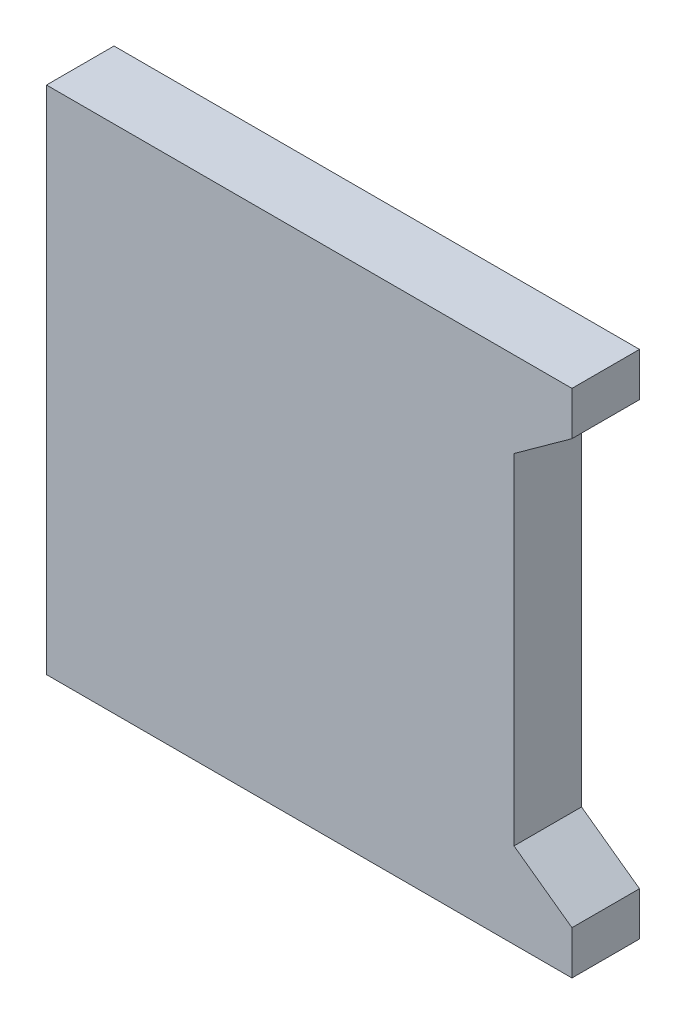
ISO-10303-21;
HEADER;
FILE_DESCRIPTION(('STEP AP214'),'2;1');
FILE_NAME('part.step','',(''),(''),'','','');
FILE_SCHEMA(('AUTOMOTIVE_DESIGN { 1 0 10303 214 1 1 1 1 }'));
ENDSEC;
DATA;
#1=APPLICATION_CONTEXT('core data for automotive mechanical design processes');
#2=APPLICATION_PROTOCOL_DEFINITION('international standard','automotive_design',2000,#1);
#3=PRODUCT_CONTEXT('',#1,'mechanical');
#4=PRODUCT('Part','Part','',(#3));
#5=PRODUCT_RELATED_PRODUCT_CATEGORY('part','',(#4));
#6=PRODUCT_DEFINITION_FORMATION('','',#4);
#7=PRODUCT_DEFINITION_CONTEXT('part definition',#1,'design');
#8=PRODUCT_DEFINITION('design','',#6,#7);
#9=PRODUCT_DEFINITION_SHAPE('','',#8);
#10=(LENGTH_UNIT() NAMED_UNIT(*) SI_UNIT(.MILLI.,.METRE.));
#11=(NAMED_UNIT(*) PLANE_ANGLE_UNIT() SI_UNIT($,.RADIAN.));
#12=(NAMED_UNIT(*) SI_UNIT($,.STERADIAN.) SOLID_ANGLE_UNIT());
#13=UNCERTAINTY_MEASURE_WITH_UNIT(LENGTH_MEASURE(1.E-05),#10,'distance_accuracy_value','');
#14=(GEOMETRIC_REPRESENTATION_CONTEXT(3) GLOBAL_UNCERTAINTY_ASSIGNED_CONTEXT((#13)) GLOBAL_UNIT_ASSIGNED_CONTEXT((#10,
#11,#12)) REPRESENTATION_CONTEXT('',''));
#15=CARTESIAN_POINT('',(0.,0.,0.));
#16=DIRECTION('',(0.,0.,1.));
#17=DIRECTION('',(1.,0.,0.));
#18=AXIS2_PLACEMENT_3D('',#15,#16,#17);
#19=CARTESIAN_POINT('',(0.,0.,1.55));
#20=DIRECTION('',(1.,0.,0.));
#21=DIRECTION('',(0.,0.,-1.));
#22=AXIS2_PLACEMENT_3D('',#19,#20,#21);
#23=PLANE('',#22);
#24=DIRECTION('',(0.,-1.,0.));
#25=VECTOR('',#24,1.);
#26=CARTESIAN_POINT('',(0.,0.,0.));
#27=LINE('',#26,#25);
#28=CARTESIAN_POINT('',(0.,11.72,0.));
#29=VERTEX_POINT('',#28);
#30=CARTESIAN_POINT('',(0.,0.,0.));
#31=VERTEX_POINT('',#30);
#32=EDGE_CURVE('E128',#29,#31,#27,.T.);
#33=ORIENTED_EDGE('',*,*,#32,.T.);
#34=DIRECTION('',(0.,0.,-1.));
#35=VECTOR('',#34,1.);
#36=CARTESIAN_POINT('',(0.,0.,1.55));
#37=LINE('',#36,#35);
#38=CARTESIAN_POINT('',(0.,0.,1.55));
#39=VERTEX_POINT('',#38);
#40=EDGE_CURVE('E11',#39,#31,#37,.T.);
#41=ORIENTED_EDGE('',*,*,#40,.F.);
#42=DIRECTION('',(0.,-1.,0.));
#43=VECTOR('',#42,1.);
#44=CARTESIAN_POINT('',(0.,0.,1.55));
#45=LINE('',#44,#43);
#46=CARTESIAN_POINT('',(0.,11.72,1.55));
#47=VERTEX_POINT('',#46);
#48=EDGE_CURVE('E142',#47,#39,#45,.T.);
#49=ORIENTED_EDGE('',*,*,#48,.F.);
#50=DIRECTION('',(0.,0.,-1.));
#51=VECTOR('',#50,1.);
#52=CARTESIAN_POINT('',(0.,11.72,1.55));
#53=LINE('',#52,#51);
#54=EDGE_CURVE('E124',#47,#29,#53,.T.);
#55=ORIENTED_EDGE('',*,*,#54,.T.);
#56=EDGE_LOOP('',(#33,#41,#49,#55));
#57=FACE_BOUND('',#56,.T.);
#58=ADVANCED_FACE('F32',(#57),#23,.F.);
#59=CARTESIAN_POINT('',(0.,0.,1.55));
#60=DIRECTION('',(0.,1.,0.));
#61=DIRECTION('',(0.,0.,1.));
#62=AXIS2_PLACEMENT_3D('',#59,#60,#61);
#63=PLANE('',#62);
#64=DIRECTION('',(1.,0.,0.));
#65=VECTOR('',#64,1.);
#66=CARTESIAN_POINT('',(0.,0.,0.));
#67=LINE('',#66,#65);
#68=CARTESIAN_POINT('',(12.06,0.,0.));
#69=VERTEX_POINT('',#68);
#70=EDGE_CURVE('E131',#31,#69,#67,.T.);
#71=ORIENTED_EDGE('',*,*,#70,.T.);
#72=DIRECTION('',(0.,0.,-1.));
#73=VECTOR('',#72,1.);
#74=CARTESIAN_POINT('',(12.06,0.,1.55));
#75=LINE('',#74,#73);
#76=CARTESIAN_POINT('',(12.06,0.,1.55));
#77=VERTEX_POINT('',#76);
#78=EDGE_CURVE('E40',#77,#69,#75,.T.);
#79=ORIENTED_EDGE('',*,*,#78,.F.);
#80=DIRECTION('',(1.,0.,0.));
#81=VECTOR('',#80,1.);
#82=CARTESIAN_POINT('',(0.,0.,1.55));
#83=LINE('',#82,#81);
#84=EDGE_CURVE('E91',#39,#77,#83,.T.);
#85=ORIENTED_EDGE('',*,*,#84,.F.);
#86=ORIENTED_EDGE('',*,*,#40,.T.);
#87=EDGE_LOOP('',(#71,#79,#85,#86));
#88=FACE_BOUND('',#87,.T.);
#89=ADVANCED_FACE('F177',(#88),#63,.F.);
#90=CARTESIAN_POINT('',(12.06,0.,1.55));
#91=DIRECTION('',(-1.,0.,0.));
#92=DIRECTION('',(0.,0.,1.));
#93=AXIS2_PLACEMENT_3D('',#90,#91,#92);
#94=PLANE('',#93);
#95=DIRECTION('',(0.,1.,0.));
#96=VECTOR('',#95,1.);
#97=CARTESIAN_POINT('',(12.06,0.,0.));
#98=LINE('',#97,#96);
#99=CARTESIAN_POINT('',(12.06,1.,0.));
#100=VERTEX_POINT('',#99);
#101=EDGE_CURVE('E133',#69,#100,#98,.T.);
#102=ORIENTED_EDGE('',*,*,#101,.T.);
#103=DIRECTION('',(0.,0.,-1.));
#104=VECTOR('',#103,1.);
#105=CARTESIAN_POINT('',(12.06,1.,1.55));
#106=LINE('',#105,#104);
#107=CARTESIAN_POINT('',(12.06,1.,1.55));
#108=VERTEX_POINT('',#107);
#109=EDGE_CURVE('E149',#108,#100,#106,.T.);
#110=ORIENTED_EDGE('',*,*,#109,.F.);
#111=DIRECTION('',(0.,1.,0.));
#112=VECTOR('',#111,1.);
#113=CARTESIAN_POINT('',(12.06,0.,1.55));
#114=LINE('',#113,#112);
#115=EDGE_CURVE('E157',#77,#108,#114,.T.);
#116=ORIENTED_EDGE('',*,*,#115,.F.);
#117=ORIENTED_EDGE('',*,*,#78,.T.);
#118=EDGE_LOOP('',(#102,#110,#116,#117));
#119=FACE_BOUND('',#118,.T.);
#120=ADVANCED_FACE('F155',(#119),#94,.F.);
#121=CARTESIAN_POINT('',(10.73,1.96,1.55));
#122=DIRECTION('',(-0.585267940011796,-0.810839958558006,0.));
#123=DIRECTION('',(0.810839958558006,-0.585267940011796,0.));
#124=AXIS2_PLACEMENT_3D('',#121,#122,#123);
#125=PLANE('',#124);
#126=DIRECTION('',(-0.810839958558006,0.585267940011796,0.));
#127=VECTOR('',#126,1.);
#128=CARTESIAN_POINT('',(10.73,1.96,0.));
#129=LINE('',#128,#127);
#130=CARTESIAN_POINT('',(10.73,1.96,0.));
#131=VERTEX_POINT('',#130);
#132=EDGE_CURVE('E135',#100,#131,#129,.T.);
#133=ORIENTED_EDGE('',*,*,#132,.T.);
#134=DIRECTION('',(0.,0.,-1.));
#135=VECTOR('',#134,1.);
#136=CARTESIAN_POINT('',(10.73,1.96,1.55));
#137=LINE('',#136,#135);
#138=CARTESIAN_POINT('',(10.73,1.96,1.55));
#139=VERTEX_POINT('',#138);
#140=EDGE_CURVE('E146',#139,#131,#137,.T.);
#141=ORIENTED_EDGE('',*,*,#140,.F.);
#142=DIRECTION('',(-0.810839958558006,0.585267940011796,0.));
#143=VECTOR('',#142,1.);
#144=CARTESIAN_POINT('',(10.73,1.96,1.55));
#145=LINE('',#144,#143);
#146=EDGE_CURVE('E169',#108,#139,#145,.T.);
#147=ORIENTED_EDGE('',*,*,#146,.F.);
#148=ORIENTED_EDGE('',*,*,#109,.T.);
#149=EDGE_LOOP('',(#133,#141,#147,#148));
#150=FACE_BOUND('',#149,.T.);
#151=ADVANCED_FACE('F165',(#150),#125,.F.);
#152=CARTESIAN_POINT('',(10.73,1.96,1.55));
#153=DIRECTION('',(-1.,0.,0.));
#154=DIRECTION('',(0.,-1.,0.));
#155=AXIS2_PLACEMENT_3D('',#152,#153,#154);
#156=PLANE('',#155);
#157=DIRECTION('',(0.,1.,0.));
#158=VECTOR('',#157,1.);
#159=CARTESIAN_POINT('',(10.73,1.96,0.));
#160=LINE('',#159,#158);
#161=CARTESIAN_POINT('',(10.73,9.76,0.));
#162=VERTEX_POINT('',#161);
#163=EDGE_CURVE('E137',#131,#162,#160,.T.);
#164=ORIENTED_EDGE('',*,*,#163,.T.);
#165=DIRECTION('',(0.,0.,-1.));
#166=VECTOR('',#165,1.);
#167=CARTESIAN_POINT('',(10.73,9.76,1.55));
#168=LINE('',#167,#166);
#169=CARTESIAN_POINT('',(10.73,9.76,1.55));
#170=VERTEX_POINT('',#169);
#171=EDGE_CURVE('E119',#170,#162,#168,.T.);
#172=ORIENTED_EDGE('',*,*,#171,.F.);
#173=DIRECTION('',(0.,1.,0.));
#174=VECTOR('',#173,1.);
#175=CARTESIAN_POINT('',(10.73,1.96,1.55));
#176=LINE('',#175,#174);
#177=EDGE_CURVE('E110',#139,#170,#176,.T.);
#178=ORIENTED_EDGE('',*,*,#177,.F.);
#179=ORIENTED_EDGE('',*,*,#140,.T.);
#180=EDGE_LOOP('',(#164,#172,#178,#179));
#181=FACE_BOUND('',#180,.T.);
#182=ADVANCED_FACE('F168',(#181),#156,.F.);
#183=CARTESIAN_POINT('',(10.73,9.76,1.55));
#184=DIRECTION('',(-0.585267940011796,0.810839958558006,0.));
#185=DIRECTION('',(-0.810839958558006,-0.585267940011796,0.));
#186=AXIS2_PLACEMENT_3D('',#183,#184,#185);
#187=PLANE('',#186);
#188=DIRECTION('',(0.810839958558006,0.585267940011796,0.));
#189=VECTOR('',#188,1.);
#190=CARTESIAN_POINT('',(10.73,9.76,0.));
#191=LINE('',#190,#189);
#192=CARTESIAN_POINT('',(12.06,10.72,0.));
#193=VERTEX_POINT('',#192);
#194=EDGE_CURVE('E118',#162,#193,#191,.T.);
#195=ORIENTED_EDGE('',*,*,#194,.T.);
#196=DIRECTION('',(0.,0.,-1.));
#197=VECTOR('',#196,1.);
#198=CARTESIAN_POINT('',(12.06,10.72,1.55));
#199=LINE('',#198,#197);
#200=CARTESIAN_POINT('',(12.06,10.72,1.55));
#201=VERTEX_POINT('',#200);
#202=EDGE_CURVE('E115',#201,#193,#199,.T.);
#203=ORIENTED_EDGE('',*,*,#202,.F.);
#204=DIRECTION('',(0.810839958558006,0.585267940011796,0.));
#205=VECTOR('',#204,1.);
#206=CARTESIAN_POINT('',(10.73,9.76,1.55));
#207=LINE('',#206,#205);
#208=EDGE_CURVE('E104',#170,#201,#207,.T.);
#209=ORIENTED_EDGE('',*,*,#208,.F.);
#210=ORIENTED_EDGE('',*,*,#171,.T.);
#211=EDGE_LOOP('',(#195,#203,#209,#210));
#212=FACE_BOUND('',#211,.T.);
#213=ADVANCED_FACE('F116',(#212),#187,.F.);
#214=CARTESIAN_POINT('',(12.06,10.72,1.55));
#215=DIRECTION('',(-1.,0.,0.));
#216=DIRECTION('',(0.,-1.,0.));
#217=AXIS2_PLACEMENT_3D('',#214,#215,#216);
#218=PLANE('',#217);
#219=DIRECTION('',(0.,1.,0.));
#220=VECTOR('',#219,1.);
#221=CARTESIAN_POINT('',(12.06,10.72,0.));
#222=LINE('',#221,#220);
#223=CARTESIAN_POINT('',(12.06,11.72,0.));
#224=VERTEX_POINT('',#223);
#225=EDGE_CURVE('E77',#193,#224,#222,.T.);
#226=ORIENTED_EDGE('',*,*,#225,.T.);
#227=DIRECTION('',(0.,0.,-1.));
#228=VECTOR('',#227,1.);
#229=CARTESIAN_POINT('',(12.06,11.72,1.55));
#230=LINE('',#229,#228);
#231=CARTESIAN_POINT('',(12.06,11.72,1.55));
#232=VERTEX_POINT('',#231);
#233=EDGE_CURVE('E120',#232,#224,#230,.T.);
#234=ORIENTED_EDGE('',*,*,#233,.F.);
#235=DIRECTION('',(0.,1.,0.));
#236=VECTOR('',#235,1.);
#237=CARTESIAN_POINT('',(12.06,10.72,1.55));
#238=LINE('',#237,#236);
#239=EDGE_CURVE('E108',#201,#232,#238,.T.);
#240=ORIENTED_EDGE('',*,*,#239,.F.);
#241=ORIENTED_EDGE('',*,*,#202,.T.);
#242=EDGE_LOOP('',(#226,#234,#240,#241));
#243=FACE_BOUND('',#242,.T.);
#244=ADVANCED_FACE('F122',(#243),#218,.F.);
#245=CARTESIAN_POINT('',(0.,11.72,1.55));
#246=DIRECTION('',(0.,-1.,0.));
#247=DIRECTION('',(0.,0.,-1.));
#248=AXIS2_PLACEMENT_3D('',#245,#246,#247);
#249=PLANE('',#248);
#250=DIRECTION('',(-1.,0.,0.));
#251=VECTOR('',#250,1.);
#252=CARTESIAN_POINT('',(0.,11.72,0.));
#253=LINE('',#252,#251);
#254=EDGE_CURVE('E83',#224,#29,#253,.T.);
#255=ORIENTED_EDGE('',*,*,#254,.T.);
#256=ORIENTED_EDGE('',*,*,#54,.F.);
#257=DIRECTION('',(-1.,0.,0.));
#258=VECTOR('',#257,1.);
#259=CARTESIAN_POINT('',(0.,11.72,1.55));
#260=LINE('',#259,#258);
#261=EDGE_CURVE('E48',#232,#47,#260,.T.);
#262=ORIENTED_EDGE('',*,*,#261,.F.);
#263=ORIENTED_EDGE('',*,*,#233,.T.);
#264=EDGE_LOOP('',(#255,#256,#262,#263));
#265=FACE_BOUND('',#264,.T.);
#266=ADVANCED_FACE('F193',(#265),#249,.F.);
#267=CARTESIAN_POINT('',(0.,0.,1.55));
#268=DIRECTION('',(0.,0.,-1.));
#269=DIRECTION('',(-1.,0.,0.));
#270=AXIS2_PLACEMENT_3D('',#267,#268,#269);
#271=PLANE('',#270);
#272=ORIENTED_EDGE('',*,*,#48,.T.);
#273=ORIENTED_EDGE('',*,*,#84,.T.);
#274=ORIENTED_EDGE('',*,*,#115,.T.);
#275=ORIENTED_EDGE('',*,*,#146,.T.);
#276=ORIENTED_EDGE('',*,*,#177,.T.);
#277=ORIENTED_EDGE('',*,*,#208,.T.);
#278=ORIENTED_EDGE('',*,*,#239,.T.);
#279=ORIENTED_EDGE('',*,*,#261,.T.);
#280=EDGE_LOOP('',(#272,#273,#274,#275,#276,#277,#278,#279));
#281=FACE_BOUND('',#280,.T.);
#282=ADVANCED_FACE('F106',(#281),#271,.F.);
#283=CARTESIAN_POINT('',(0.,0.,0.));
#284=DIRECTION('',(0.,0.,-1.));
#285=DIRECTION('',(-1.,0.,0.));
#286=AXIS2_PLACEMENT_3D('',#283,#284,#285);
#287=PLANE('',#286);
#288=ORIENTED_EDGE('',*,*,#32,.F.);
#289=ORIENTED_EDGE('',*,*,#254,.F.);
#290=ORIENTED_EDGE('',*,*,#225,.F.);
#291=ORIENTED_EDGE('',*,*,#194,.F.);
#292=ORIENTED_EDGE('',*,*,#163,.F.);
#293=ORIENTED_EDGE('',*,*,#132,.F.);
#294=ORIENTED_EDGE('',*,*,#101,.F.);
#295=ORIENTED_EDGE('',*,*,#70,.F.);
#296=EDGE_LOOP('',(#288,#289,#290,#291,#292,#293,#294,#295));
#297=FACE_BOUND('',#296,.T.);
#298=ADVANCED_FACE('F161',(#297),#287,.T.);
#299=CLOSED_SHELL('',(#58,#89,#120,#151,#182,#213,#244,#266,#282,#298));
#300=MANIFOLD_SOLID_BREP('B2',#299);
#301=ADVANCED_BREP_SHAPE_REPRESENTATION('',(#18,#300),#14);
#302=SHAPE_DEFINITION_REPRESENTATION(#9,#301);
ENDSEC;
END-ISO-10303-21;
